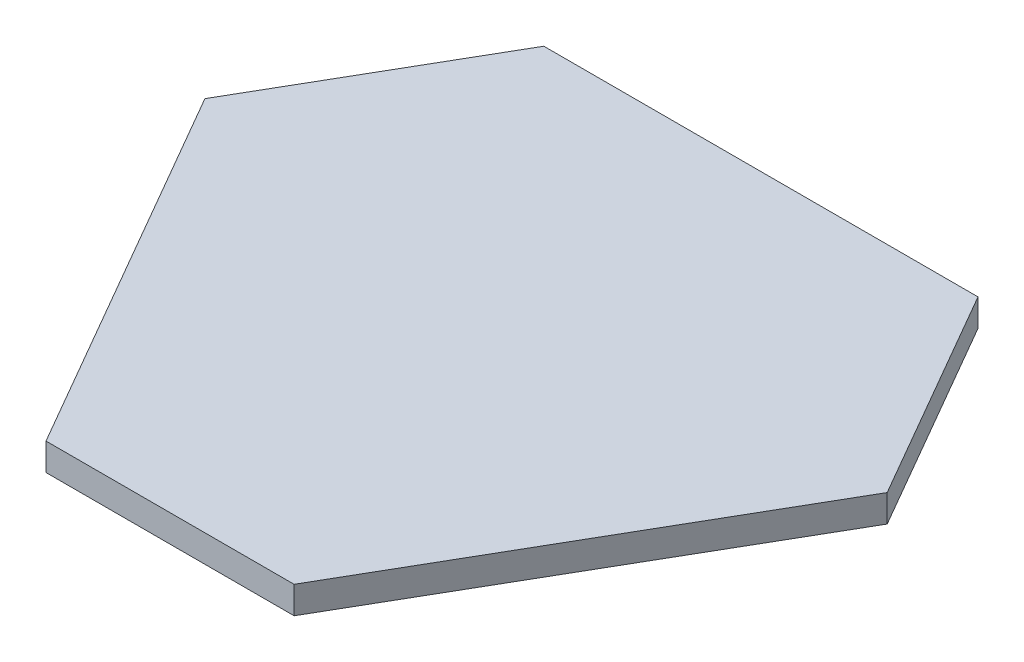
ISO-10303-21;
HEADER;
FILE_DESCRIPTION(('STEP AP214'),'2;1');
FILE_NAME('part.step','',(''),(''),'','','');
FILE_SCHEMA(('AUTOMOTIVE_DESIGN { 1 0 10303 214 1 1 1 1 }'));
ENDSEC;
DATA;
#1=APPLICATION_CONTEXT('core data for automotive mechanical design processes');
#2=APPLICATION_PROTOCOL_DEFINITION('international standard','automotive_design',2000,#1);
#3=PRODUCT_CONTEXT('',#1,'mechanical');
#4=PRODUCT('Part','Part','',(#3));
#5=PRODUCT_RELATED_PRODUCT_CATEGORY('part','',(#4));
#6=PRODUCT_DEFINITION_FORMATION('','',#4);
#7=PRODUCT_DEFINITION_CONTEXT('part definition',#1,'design');
#8=PRODUCT_DEFINITION('design','',#6,#7);
#9=PRODUCT_DEFINITION_SHAPE('','',#8);
#10=(LENGTH_UNIT() NAMED_UNIT(*) SI_UNIT(.MILLI.,.METRE.));
#11=(NAMED_UNIT(*) PLANE_ANGLE_UNIT() SI_UNIT($,.RADIAN.));
#12=(NAMED_UNIT(*) SI_UNIT($,.STERADIAN.) SOLID_ANGLE_UNIT());
#13=UNCERTAINTY_MEASURE_WITH_UNIT(LENGTH_MEASURE(1.E-05),#10,'distance_accuracy_value','');
#14=(GEOMETRIC_REPRESENTATION_CONTEXT(3) GLOBAL_UNCERTAINTY_ASSIGNED_CONTEXT((#13)) GLOBAL_UNIT_ASSIGNED_CONTEXT((#10,
#11,#12)) REPRESENTATION_CONTEXT('',''));
#15=CARTESIAN_POINT('',(0.,0.,0.));
#16=DIRECTION('',(0.,0.,1.));
#17=DIRECTION('',(1.,0.,0.));
#18=AXIS2_PLACEMENT_3D('',#15,#16,#17);
#19=CARTESIAN_POINT('',(54.1265877365274,6.35,31.25));
#20=DIRECTION('',(0.866025403784439,0.,0.5));
#21=DIRECTION('',(0.5,0.,-0.866025403784439));
#22=AXIS2_PLACEMENT_3D('',#19,#20,#21);
#23=PLANE('',#22);
#24=DIRECTION('',(-0.5,0.,0.866025403784439));
#25=VECTOR('',#24,1.);
#26=CARTESIAN_POINT('',(54.1265877365274,0.,31.25));
#27=LINE('',#26,#25);
#28=CARTESIAN_POINT('',(79.3856620135735,0.,-12.5));
#29=VERTEX_POINT('',#28);
#30=CARTESIAN_POINT('',(28.8675134594813,0.,75.));
#31=VERTEX_POINT('',#30);
#32=EDGE_CURVE('E127',#29,#31,#27,.T.);
#33=ORIENTED_EDGE('',*,*,#32,.F.);
#34=DIRECTION('',(0.,-1.,0.));
#35=VECTOR('',#34,1.);
#36=CARTESIAN_POINT('',(79.3856620135735,6.35,-12.5));
#37=LINE('',#36,#35);
#38=CARTESIAN_POINT('',(79.3856620135735,6.35,-12.5));
#39=VERTEX_POINT('',#38);
#40=EDGE_CURVE('E11',#39,#29,#37,.T.);
#41=ORIENTED_EDGE('',*,*,#40,.F.);
#42=DIRECTION('',(-0.5,0.,0.866025403784439));
#43=VECTOR('',#42,1.);
#44=CARTESIAN_POINT('',(54.1265877365274,6.35,31.25));
#45=LINE('',#44,#43);
#46=CARTESIAN_POINT('',(28.8675134594813,6.35,75.));
#47=VERTEX_POINT('',#46);
#48=EDGE_CURVE('E147',#39,#47,#45,.T.);
#49=ORIENTED_EDGE('',*,*,#48,.T.);
#50=DIRECTION('',(0.,-1.,0.));
#51=VECTOR('',#50,1.);
#52=CARTESIAN_POINT('',(28.8675134594813,6.35,75.));
#53=LINE('',#52,#51);
#54=EDGE_CURVE('E86',#47,#31,#53,.T.);
#55=ORIENTED_EDGE('',*,*,#54,.T.);
#56=EDGE_LOOP('',(#33,#41,#49,#55));
#57=FACE_BOUND('',#56,.T.);
#58=ADVANCED_FACE('F41',(#57),#23,.T.);
#59=CARTESIAN_POINT('',(64.9519052838329,6.35,-37.5));
#60=DIRECTION('',(-0.866025403784439,0.,0.5));
#61=DIRECTION('',(0.5,0.,0.866025403784439));
#62=AXIS2_PLACEMENT_3D('',#59,#60,#61);
#63=PLANE('',#62);
#64=DIRECTION('',(-0.5,0.,-0.866025403784439));
#65=VECTOR('',#64,1.);
#66=CARTESIAN_POINT('',(64.9519052838329,0.,-37.5));
#67=LINE('',#66,#65);
#68=CARTESIAN_POINT('',(50.5181485540922,0.,-62.5));
#69=VERTEX_POINT('',#68);
#70=EDGE_CURVE('E131',#29,#69,#67,.T.);
#71=ORIENTED_EDGE('',*,*,#70,.T.);
#72=DIRECTION('',(0.,-1.,0.));
#73=VECTOR('',#72,1.);
#74=CARTESIAN_POINT('',(50.5181485540922,6.35,-62.5));
#75=LINE('',#74,#73);
#76=CARTESIAN_POINT('',(50.5181485540922,6.35,-62.5));
#77=VERTEX_POINT('',#76);
#78=EDGE_CURVE('E50',#77,#69,#75,.T.);
#79=ORIENTED_EDGE('',*,*,#78,.F.);
#80=DIRECTION('',(-0.5,0.,-0.866025403784439));
#81=VECTOR('',#80,1.);
#82=CARTESIAN_POINT('',(64.9519052838329,6.35,-37.5));
#83=LINE('',#82,#81);
#84=EDGE_CURVE('E165',#39,#77,#83,.T.);
#85=ORIENTED_EDGE('',*,*,#84,.F.);
#86=ORIENTED_EDGE('',*,*,#40,.T.);
#87=EDGE_LOOP('',(#71,#79,#85,#86));
#88=FACE_BOUND('',#87,.T.);
#89=ADVANCED_FACE('F160',(#88),#63,.F.);
#90=CARTESIAN_POINT('',(0.,6.35,-62.5));
#91=DIRECTION('',(0.,0.,-1.));
#92=DIRECTION('',(-1.,0.,0.));
#93=AXIS2_PLACEMENT_3D('',#90,#91,#92);
#94=PLANE('',#93);
#95=DIRECTION('',(1.,0.,0.));
#96=VECTOR('',#95,1.);
#97=CARTESIAN_POINT('',(0.,0.,-62.5));
#98=LINE('',#97,#96);
#99=CARTESIAN_POINT('',(-50.5181485540923,0.,-62.5));
#100=VERTEX_POINT('',#99);
#101=EDGE_CURVE('E135',#100,#69,#98,.T.);
#102=ORIENTED_EDGE('',*,*,#101,.F.);
#103=DIRECTION('',(0.,-1.,0.));
#104=VECTOR('',#103,1.);
#105=CARTESIAN_POINT('',(-50.5181485540923,6.35,-62.5));
#106=LINE('',#105,#104);
#107=CARTESIAN_POINT('',(-50.5181485540923,6.35,-62.5));
#108=VERTEX_POINT('',#107);
#109=EDGE_CURVE('E118',#108,#100,#106,.T.);
#110=ORIENTED_EDGE('',*,*,#109,.F.);
#111=DIRECTION('',(1.,0.,0.));
#112=VECTOR('',#111,1.);
#113=CARTESIAN_POINT('',(0.,6.35,-62.5));
#114=LINE('',#113,#112);
#115=EDGE_CURVE('E105',#108,#77,#114,.T.);
#116=ORIENTED_EDGE('',*,*,#115,.T.);
#117=ORIENTED_EDGE('',*,*,#78,.T.);
#118=EDGE_LOOP('',(#102,#110,#116,#117));
#119=FACE_BOUND('',#118,.T.);
#120=ADVANCED_FACE('F157',(#119),#94,.T.);
#121=CARTESIAN_POINT('',(-64.9519052838329,6.35,-37.5));
#122=DIRECTION('',(0.866025403784439,0.,0.5));
#123=DIRECTION('',(0.5,0.,-0.866025403784439));
#124=AXIS2_PLACEMENT_3D('',#121,#122,#123);
#125=PLANE('',#124);
#126=DIRECTION('',(-0.5,0.,0.866025403784439));
#127=VECTOR('',#126,1.);
#128=CARTESIAN_POINT('',(-64.9519052838329,0.,-37.5));
#129=LINE('',#128,#127);
#130=CARTESIAN_POINT('',(-79.3856620135736,0.,-12.5));
#131=VERTEX_POINT('',#130);
#132=EDGE_CURVE('E113',#100,#131,#129,.T.);
#133=ORIENTED_EDGE('',*,*,#132,.T.);
#134=DIRECTION('',(0.,-1.,0.));
#135=VECTOR('',#134,1.);
#136=CARTESIAN_POINT('',(-79.3856620135736,6.35,-12.5));
#137=LINE('',#136,#135);
#138=CARTESIAN_POINT('',(-79.3856620135736,6.35,-12.5));
#139=VERTEX_POINT('',#138);
#140=EDGE_CURVE('E110',#139,#131,#137,.T.);
#141=ORIENTED_EDGE('',*,*,#140,.F.);
#142=DIRECTION('',(-0.5,0.,0.866025403784439));
#143=VECTOR('',#142,1.);
#144=CARTESIAN_POINT('',(-64.9519052838329,6.35,-37.5));
#145=LINE('',#144,#143);
#146=EDGE_CURVE('E99',#108,#139,#145,.T.);
#147=ORIENTED_EDGE('',*,*,#146,.F.);
#148=ORIENTED_EDGE('',*,*,#109,.T.);
#149=EDGE_LOOP('',(#133,#141,#147,#148));
#150=FACE_BOUND('',#149,.T.);
#151=ADVANCED_FACE('F111',(#150),#125,.F.);
#152=CARTESIAN_POINT('',(-54.1265877365274,6.35,31.25));
#153=DIRECTION('',(-0.866025403784439,0.,0.5));
#154=DIRECTION('',(0.5,0.,0.866025403784439));
#155=AXIS2_PLACEMENT_3D('',#152,#153,#154);
#156=PLANE('',#155);
#157=DIRECTION('',(-0.5,0.,-0.866025403784439));
#158=VECTOR('',#157,1.);
#159=CARTESIAN_POINT('',(-54.1265877365274,0.,31.25));
#160=LINE('',#159,#158);
#161=CARTESIAN_POINT('',(-28.8675134594813,0.,75.));
#162=VERTEX_POINT('',#161);
#163=EDGE_CURVE('E141',#162,#131,#160,.T.);
#164=ORIENTED_EDGE('',*,*,#163,.F.);
#165=DIRECTION('',(0.,-1.,0.));
#166=VECTOR('',#165,1.);
#167=CARTESIAN_POINT('',(-28.8675134594813,6.35,75.));
#168=LINE('',#167,#166);
#169=CARTESIAN_POINT('',(-28.8675134594813,6.35,75.));
#170=VERTEX_POINT('',#169);
#171=EDGE_CURVE('E79',#170,#162,#168,.T.);
#172=ORIENTED_EDGE('',*,*,#171,.F.);
#173=DIRECTION('',(-0.5,0.,-0.866025403784439));
#174=VECTOR('',#173,1.);
#175=CARTESIAN_POINT('',(-54.1265877365274,6.35,31.25));
#176=LINE('',#175,#174);
#177=EDGE_CURVE('E103',#170,#139,#176,.T.);
#178=ORIENTED_EDGE('',*,*,#177,.T.);
#179=ORIENTED_EDGE('',*,*,#140,.T.);
#180=EDGE_LOOP('',(#164,#172,#178,#179));
#181=FACE_BOUND('',#180,.T.);
#182=ADVANCED_FACE('F120',(#181),#156,.T.);
#183=CARTESIAN_POINT('',(0.,6.35,75.));
#184=DIRECTION('',(0.,0.,-1.));
#185=DIRECTION('',(-1.,0.,0.));
#186=AXIS2_PLACEMENT_3D('',#183,#184,#185);
#187=PLANE('',#186);
#188=DIRECTION('',(1.,0.,0.));
#189=VECTOR('',#188,1.);
#190=CARTESIAN_POINT('',(0.,0.,75.));
#191=LINE('',#190,#189);
#192=EDGE_CURVE('E144',#162,#31,#191,.T.);
#193=ORIENTED_EDGE('',*,*,#192,.T.);
#194=ORIENTED_EDGE('',*,*,#54,.F.);
#195=DIRECTION('',(1.,0.,0.));
#196=VECTOR('',#195,1.);
#197=CARTESIAN_POINT('',(0.,6.35,75.));
#198=LINE('',#197,#196);
#199=EDGE_CURVE('E58',#170,#47,#198,.T.);
#200=ORIENTED_EDGE('',*,*,#199,.F.);
#201=ORIENTED_EDGE('',*,*,#171,.T.);
#202=EDGE_LOOP('',(#193,#194,#200,#201));
#203=FACE_BOUND('',#202,.T.);
#204=ADVANCED_FACE('F163',(#203),#187,.F.);
#205=CARTESIAN_POINT('',(0.,6.35,0.));
#206=DIRECTION('',(0.,1.,0.));
#207=DIRECTION('',(0.,0.,1.));
#208=AXIS2_PLACEMENT_3D('',#205,#206,#207);
#209=PLANE('',#208);
#210=ORIENTED_EDGE('',*,*,#48,.F.);
#211=ORIENTED_EDGE('',*,*,#84,.T.);
#212=ORIENTED_EDGE('',*,*,#115,.F.);
#213=ORIENTED_EDGE('',*,*,#146,.T.);
#214=ORIENTED_EDGE('',*,*,#177,.F.);
#215=ORIENTED_EDGE('',*,*,#199,.T.);
#216=EDGE_LOOP('',(#210,#211,#212,#213,#214,#215));
#217=FACE_BOUND('',#216,.T.);
#218=ADVANCED_FACE('F101',(#217),#209,.T.);
#219=CARTESIAN_POINT('',(0.,0.,0.));
#220=DIRECTION('',(0.,1.,0.));
#221=DIRECTION('',(0.,0.,1.));
#222=AXIS2_PLACEMENT_3D('',#219,#220,#221);
#223=PLANE('',#222);
#224=ORIENTED_EDGE('',*,*,#32,.T.);
#225=ORIENTED_EDGE('',*,*,#192,.F.);
#226=ORIENTED_EDGE('',*,*,#163,.T.);
#227=ORIENTED_EDGE('',*,*,#132,.F.);
#228=ORIENTED_EDGE('',*,*,#101,.T.);
#229=ORIENTED_EDGE('',*,*,#70,.F.);
#230=EDGE_LOOP('',(#224,#225,#226,#227,#228,#229));
#231=FACE_BOUND('',#230,.T.);
#232=ADVANCED_FACE('F162',(#231),#223,.F.);
#233=CLOSED_SHELL('',(#58,#89,#120,#151,#182,#204,#218,#232));
#234=MANIFOLD_SOLID_BREP('B2',#233);
#235=ADVANCED_BREP_SHAPE_REPRESENTATION('',(#18,#234),#14);
#236=SHAPE_DEFINITION_REPRESENTATION(#9,#235);
ENDSEC;
END-ISO-10303-21;
